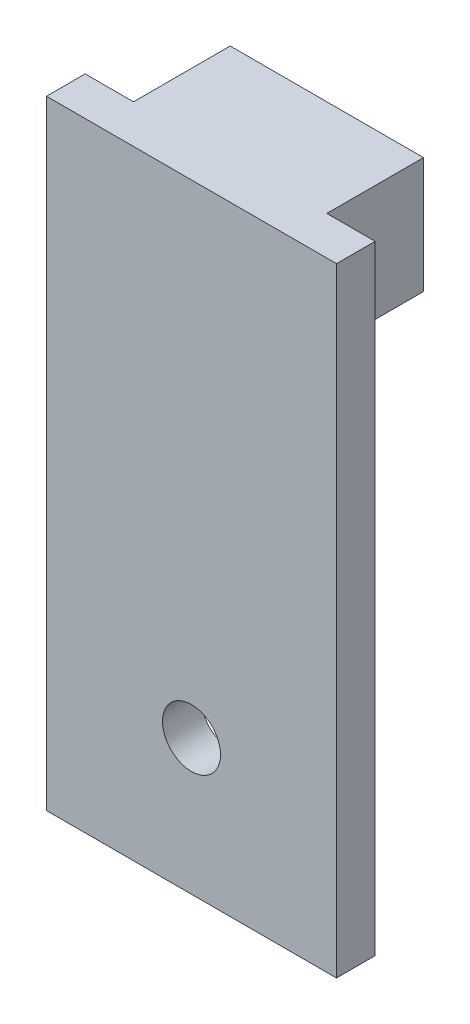
ISO-10303-21;
HEADER;
FILE_DESCRIPTION(('STEP AP214'),'2;1');
FILE_NAME('part.step','',(''),(''),'','','');
FILE_SCHEMA(('AUTOMOTIVE_DESIGN { 1 0 10303 214 1 1 1 1 }'));
ENDSEC;
DATA;
#1=APPLICATION_CONTEXT('core data for automotive mechanical design processes');
#2=APPLICATION_PROTOCOL_DEFINITION('international standard','automotive_design',2000,#1);
#3=PRODUCT_CONTEXT('',#1,'mechanical');
#4=PRODUCT('Part','Part','',(#3));
#5=PRODUCT_RELATED_PRODUCT_CATEGORY('part','',(#4));
#6=PRODUCT_DEFINITION_FORMATION('','',#4);
#7=PRODUCT_DEFINITION_CONTEXT('part definition',#1,'design');
#8=PRODUCT_DEFINITION('design','',#6,#7);
#9=PRODUCT_DEFINITION_SHAPE('','',#8);
#10=(LENGTH_UNIT() NAMED_UNIT(*) SI_UNIT(.MILLI.,.METRE.));
#11=(NAMED_UNIT(*) PLANE_ANGLE_UNIT() SI_UNIT($,.RADIAN.));
#12=(NAMED_UNIT(*) SI_UNIT($,.STERADIAN.) SOLID_ANGLE_UNIT());
#13=UNCERTAINTY_MEASURE_WITH_UNIT(LENGTH_MEASURE(1.E-05),#10,'distance_accuracy_value','');
#14=(GEOMETRIC_REPRESENTATION_CONTEXT(3) GLOBAL_UNCERTAINTY_ASSIGNED_CONTEXT((#13)) GLOBAL_UNIT_ASSIGNED_CONTEXT((#10,
#11,#12)) REPRESENTATION_CONTEXT('',''));
#15=CARTESIAN_POINT('',(0.,0.,0.));
#16=DIRECTION('',(0.,0.,1.));
#17=DIRECTION('',(1.,0.,0.));
#18=AXIS2_PLACEMENT_3D('',#15,#16,#17);
#19=CARTESIAN_POINT('',(0.,0.,0.));
#20=DIRECTION('',(0.,0.,1.));
#21=DIRECTION('',(1.,0.,0.));
#22=AXIS2_PLACEMENT_3D('',#19,#20,#21);
#23=PLANE('',#22);
#24=CARTESIAN_POINT('',(0.,-9.00000000000001,0.));
#25=DIRECTION('',(0.,0.,1.));
#26=DIRECTION('',(1.,0.,0.));
#27=AXIS2_PLACEMENT_3D('',#24,#25,#26);
#28=CIRCLE('',#27,1.5);
#29=CARTESIAN_POINT('',(1.5,-9.00000000000001,0.));
#30=VERTEX_POINT('',#29);
#31=EDGE_CURVE('E156',#30,#30,#28,.T.);
#32=ORIENTED_EDGE('',*,*,#31,.T.);
#33=EDGE_LOOP('',(#32));
#34=FACE_BOUND('',#33,.T.);
#35=DIRECTION('',(0.,1.,0.));
#36=VECTOR('',#35,1.);
#37=CARTESIAN_POINT('',(-5.,16.,0.));
#38=LINE('',#37,#36);
#39=CARTESIAN_POINT('',(-5.,10.,0.));
#40=VERTEX_POINT('',#39);
#41=CARTESIAN_POINT('',(-5.,16.,0.));
#42=VERTEX_POINT('',#41);
#43=EDGE_CURVE('E131',#40,#42,#38,.T.);
#44=ORIENTED_EDGE('',*,*,#43,.F.);
#45=DIRECTION('',(-1.,0.,0.));
#46=VECTOR('',#45,1.);
#47=CARTESIAN_POINT('',(5.,10.,0.));
#48=LINE('',#47,#46);
#49=CARTESIAN_POINT('',(5.,10.,0.));
#50=VERTEX_POINT('',#49);
#51=EDGE_CURVE('E117',#50,#40,#48,.T.);
#52=ORIENTED_EDGE('',*,*,#51,.F.);
#53=DIRECTION('',(0.,-1.,0.));
#54=VECTOR('',#53,1.);
#55=CARTESIAN_POINT('',(5.,16.,0.));
#56=LINE('',#55,#54);
#57=CARTESIAN_POINT('',(5.,16.,0.));
#58=VERTEX_POINT('',#57);
#59=EDGE_CURVE('E127',#58,#50,#56,.T.);
#60=ORIENTED_EDGE('',*,*,#59,.F.);
#61=DIRECTION('',(-1.,0.,0.));
#62=VECTOR('',#61,1.);
#63=CARTESIAN_POINT('',(-7.5,16.,0.));
#64=LINE('',#63,#62);
#65=CARTESIAN_POINT('',(7.5,16.,0.));
#66=VERTEX_POINT('',#65);
#67=EDGE_CURVE('E189',#66,#58,#64,.T.);
#68=ORIENTED_EDGE('',*,*,#67,.F.);
#69=DIRECTION('',(0.,1.,0.));
#70=VECTOR('',#69,1.);
#71=CARTESIAN_POINT('',(7.5,16.,0.));
#72=LINE('',#71,#70);
#73=CARTESIAN_POINT('',(7.5,-16.,0.));
#74=VERTEX_POINT('',#73);
#75=EDGE_CURVE('E182',#74,#66,#72,.T.);
#76=ORIENTED_EDGE('',*,*,#75,.F.);
#77=DIRECTION('',(1.,0.,0.));
#78=VECTOR('',#77,1.);
#79=CARTESIAN_POINT('',(-7.5,-16.,0.));
#80=LINE('',#79,#78);
#81=CARTESIAN_POINT('',(-7.5,-16.,0.));
#82=VERTEX_POINT('',#81);
#83=EDGE_CURVE('E209',#82,#74,#80,.T.);
#84=ORIENTED_EDGE('',*,*,#83,.F.);
#85=DIRECTION('',(0.,-1.,0.));
#86=VECTOR('',#85,1.);
#87=CARTESIAN_POINT('',(-7.5,16.,0.));
#88=LINE('',#87,#86);
#89=CARTESIAN_POINT('',(-7.5,16.,0.));
#90=VERTEX_POINT('',#89);
#91=EDGE_CURVE('E195',#90,#82,#88,.T.);
#92=ORIENTED_EDGE('',*,*,#91,.F.);
#93=EDGE_CURVE('E138',#42,#90,#64,.T.);
#94=ORIENTED_EDGE('',*,*,#93,.F.);
#95=EDGE_LOOP('',(#44,#52,#60,#68,#76,#84,#92,#94));
#96=FACE_BOUND('',#95,.T.);
#97=ADVANCED_FACE('F36',(#34,#96),#23,.F.);
#98=CARTESIAN_POINT('',(7.5,16.,2.));
#99=DIRECTION('',(-1.,0.,0.));
#100=DIRECTION('',(0.,-1.,0.));
#101=AXIS2_PLACEMENT_3D('',#98,#99,#100);
#102=PLANE('',#101);
#103=ORIENTED_EDGE('',*,*,#75,.T.);
#104=DIRECTION('',(0.,0.,-1.));
#105=VECTOR('',#104,1.);
#106=CARTESIAN_POINT('',(7.5,16.,2.));
#107=LINE('',#106,#105);
#108=CARTESIAN_POINT('',(7.5,16.,2.));
#109=VERTEX_POINT('',#108);
#110=EDGE_CURVE('E199',#109,#66,#107,.T.);
#111=ORIENTED_EDGE('',*,*,#110,.F.);
#112=DIRECTION('',(0.,1.,0.));
#113=VECTOR('',#112,1.);
#114=CARTESIAN_POINT('',(7.5,16.,2.));
#115=LINE('',#114,#113);
#116=CARTESIAN_POINT('',(7.5,-16.,2.));
#117=VERTEX_POINT('',#116);
#118=EDGE_CURVE('E210',#117,#109,#115,.T.);
#119=ORIENTED_EDGE('',*,*,#118,.F.);
#120=DIRECTION('',(0.,0.,-1.));
#121=VECTOR('',#120,1.);
#122=CARTESIAN_POINT('',(7.5,-16.,2.));
#123=LINE('',#122,#121);
#124=EDGE_CURVE('E208',#117,#74,#123,.T.);
#125=ORIENTED_EDGE('',*,*,#124,.T.);
#126=EDGE_LOOP('',(#103,#111,#119,#125));
#127=FACE_BOUND('',#126,.T.);
#128=ADVANCED_FACE('F227',(#127),#102,.F.);
#129=CARTESIAN_POINT('',(-7.5,16.,2.));
#130=DIRECTION('',(0.,-1.,0.));
#131=DIRECTION('',(0.,0.,-1.));
#132=AXIS2_PLACEMENT_3D('',#129,#130,#131);
#133=PLANE('',#132);
#134=DIRECTION('',(0.,0.,1.));
#135=VECTOR('',#134,1.);
#136=CARTESIAN_POINT('',(5.,16.,-6.));
#137=LINE('',#136,#135);
#138=CARTESIAN_POINT('',(5.,16.,-5.));
#139=VERTEX_POINT('',#138);
#140=EDGE_CURVE('E121',#139,#58,#137,.T.);
#141=ORIENTED_EDGE('',*,*,#140,.F.);
#142=DIRECTION('',(-1.,0.,0.));
#143=VECTOR('',#142,1.);
#144=CARTESIAN_POINT('',(-5.,16.,-5.));
#145=LINE('',#144,#143);
#146=CARTESIAN_POINT('',(-5.,16.,-5.));
#147=VERTEX_POINT('',#146);
#148=EDGE_CURVE('E45',#139,#147,#145,.T.);
#149=ORIENTED_EDGE('',*,*,#148,.T.);
#150=DIRECTION('',(0.,0.,1.));
#151=VECTOR('',#150,1.);
#152=CARTESIAN_POINT('',(-5.,16.,-6.));
#153=LINE('',#152,#151);
#154=EDGE_CURVE('E149',#147,#42,#153,.T.);
#155=ORIENTED_EDGE('',*,*,#154,.T.);
#156=ORIENTED_EDGE('',*,*,#93,.T.);
#157=DIRECTION('',(0.,0.,-1.));
#158=VECTOR('',#157,1.);
#159=CARTESIAN_POINT('',(-7.5,16.,2.));
#160=LINE('',#159,#158);
#161=CARTESIAN_POINT('',(-7.5,16.,2.));
#162=VERTEX_POINT('',#161);
#163=EDGE_CURVE('E202',#162,#90,#160,.T.);
#164=ORIENTED_EDGE('',*,*,#163,.F.);
#165=DIRECTION('',(-1.,0.,0.));
#166=VECTOR('',#165,1.);
#167=CARTESIAN_POINT('',(-7.5,16.,2.));
#168=LINE('',#167,#166);
#169=EDGE_CURVE('E215',#109,#162,#168,.T.);
#170=ORIENTED_EDGE('',*,*,#169,.F.);
#171=ORIENTED_EDGE('',*,*,#110,.T.);
#172=ORIENTED_EDGE('',*,*,#67,.T.);
#173=EDGE_LOOP('',(#141,#149,#155,#156,#164,#170,#171,#172));
#174=FACE_BOUND('',#173,.T.);
#175=ADVANCED_FACE('F225',(#174),#133,.F.);
#176=CARTESIAN_POINT('',(-7.5,16.,2.));
#177=DIRECTION('',(1.,0.,0.));
#178=DIRECTION('',(0.,1.,0.));
#179=AXIS2_PLACEMENT_3D('',#176,#177,#178);
#180=PLANE('',#179);
#181=ORIENTED_EDGE('',*,*,#91,.T.);
#182=DIRECTION('',(0.,0.,-1.));
#183=VECTOR('',#182,1.);
#184=CARTESIAN_POINT('',(-7.5,-16.,2.));
#185=LINE('',#184,#183);
#186=CARTESIAN_POINT('',(-7.5,-16.,2.));
#187=VERTEX_POINT('',#186);
#188=EDGE_CURVE('E205',#187,#82,#185,.T.);
#189=ORIENTED_EDGE('',*,*,#188,.F.);
#190=DIRECTION('',(0.,-1.,0.));
#191=VECTOR('',#190,1.);
#192=CARTESIAN_POINT('',(-7.5,16.,2.));
#193=LINE('',#192,#191);
#194=EDGE_CURVE('E230',#162,#187,#193,.T.);
#195=ORIENTED_EDGE('',*,*,#194,.F.);
#196=ORIENTED_EDGE('',*,*,#163,.T.);
#197=EDGE_LOOP('',(#181,#189,#195,#196));
#198=FACE_BOUND('',#197,.T.);
#199=ADVANCED_FACE('F220',(#198),#180,.F.);
#200=CARTESIAN_POINT('',(-7.5,-16.,2.));
#201=DIRECTION('',(0.,1.,0.));
#202=DIRECTION('',(0.,0.,1.));
#203=AXIS2_PLACEMENT_3D('',#200,#201,#202);
#204=PLANE('',#203);
#205=ORIENTED_EDGE('',*,*,#83,.T.);
#206=ORIENTED_EDGE('',*,*,#124,.F.);
#207=DIRECTION('',(1.,0.,0.));
#208=VECTOR('',#207,1.);
#209=CARTESIAN_POINT('',(-7.5,-16.,2.));
#210=LINE('',#209,#208);
#211=EDGE_CURVE('E191',#187,#117,#210,.T.);
#212=ORIENTED_EDGE('',*,*,#211,.F.);
#213=ORIENTED_EDGE('',*,*,#188,.T.);
#214=EDGE_LOOP('',(#205,#206,#212,#213));
#215=FACE_BOUND('',#214,.T.);
#216=ADVANCED_FACE('F224',(#215),#204,.F.);
#217=CARTESIAN_POINT('',(0.,0.,2.));
#218=DIRECTION('',(0.,0.,1.));
#219=DIRECTION('',(1.,0.,0.));
#220=AXIS2_PLACEMENT_3D('',#217,#218,#219);
#221=PLANE('',#220);
#222=CARTESIAN_POINT('',(0.,-9.00000000000001,2.));
#223=DIRECTION('',(0.,0.,1.));
#224=DIRECTION('',(1.,0.,0.));
#225=AXIS2_PLACEMENT_3D('',#222,#223,#224);
#226=CIRCLE('',#225,1.5);
#227=CARTESIAN_POINT('',(1.5,-9.00000000000001,2.));
#228=VERTEX_POINT('',#227);
#229=EDGE_CURVE('E373',#228,#228,#226,.T.);
#230=ORIENTED_EDGE('',*,*,#229,.F.);
#231=EDGE_LOOP('',(#230));
#232=FACE_BOUND('',#231,.T.);
#233=ORIENTED_EDGE('',*,*,#118,.T.);
#234=ORIENTED_EDGE('',*,*,#169,.T.);
#235=ORIENTED_EDGE('',*,*,#194,.T.);
#236=ORIENTED_EDGE('',*,*,#211,.T.);
#237=EDGE_LOOP('',(#233,#234,#235,#236));
#238=FACE_BOUND('',#237,.T.);
#239=ADVANCED_FACE('F229',(#232,#238),#221,.T.);
#240=CARTESIAN_POINT('',(-5.,16.,-6.));
#241=DIRECTION('',(1.,0.,0.));
#242=DIRECTION('',(0.,1.,0.));
#243=AXIS2_PLACEMENT_3D('',#240,#241,#242);
#244=PLANE('',#243);
#245=ORIENTED_EDGE('',*,*,#154,.F.);
#246=DIRECTION('',(0.,-1.,0.));
#247=VECTOR('',#246,1.);
#248=CARTESIAN_POINT('',(-5.,10.,-5.));
#249=LINE('',#248,#247);
#250=CARTESIAN_POINT('',(-5.,10.,-5.));
#251=VERTEX_POINT('',#250);
#252=EDGE_CURVE('E150',#147,#251,#249,.T.);
#253=ORIENTED_EDGE('',*,*,#252,.T.);
#254=DIRECTION('',(0.,0.,1.));
#255=VECTOR('',#254,1.);
#256=CARTESIAN_POINT('',(-5.,10.,-6.));
#257=LINE('',#256,#255);
#258=EDGE_CURVE('E122',#251,#40,#257,.T.);
#259=ORIENTED_EDGE('',*,*,#258,.T.);
#260=ORIENTED_EDGE('',*,*,#43,.T.);
#261=EDGE_LOOP('',(#245,#253,#259,#260));
#262=FACE_BOUND('',#261,.T.);
#263=ADVANCED_FACE('F289',(#262),#244,.F.);
#264=CARTESIAN_POINT('',(5.,16.,-6.));
#265=DIRECTION('',(-1.,0.,0.));
#266=DIRECTION('',(0.,-1.,0.));
#267=AXIS2_PLACEMENT_3D('',#264,#265,#266);
#268=PLANE('',#267);
#269=DIRECTION('',(0.,0.,1.));
#270=VECTOR('',#269,1.);
#271=CARTESIAN_POINT('',(5.,10.,-6.));
#272=LINE('',#271,#270);
#273=CARTESIAN_POINT('',(5.,10.,-5.));
#274=VERTEX_POINT('',#273);
#275=EDGE_CURVE('E113',#274,#50,#272,.T.);
#276=ORIENTED_EDGE('',*,*,#275,.F.);
#277=DIRECTION('',(0.,1.,0.));
#278=VECTOR('',#277,1.);
#279=CARTESIAN_POINT('',(5.,16.,-5.));
#280=LINE('',#279,#278);
#281=EDGE_CURVE('E11',#274,#139,#280,.T.);
#282=ORIENTED_EDGE('',*,*,#281,.T.);
#283=ORIENTED_EDGE('',*,*,#140,.T.);
#284=ORIENTED_EDGE('',*,*,#59,.T.);
#285=EDGE_LOOP('',(#276,#282,#283,#284));
#286=FACE_BOUND('',#285,.T.);
#287=ADVANCED_FACE('F133',(#286),#268,.F.);
#288=CARTESIAN_POINT('',(5.,10.,-6.));
#289=DIRECTION('',(0.,1.,0.));
#290=DIRECTION('',(0.,0.,1.));
#291=AXIS2_PLACEMENT_3D('',#288,#289,#290);
#292=PLANE('',#291);
#293=ORIENTED_EDGE('',*,*,#258,.F.);
#294=DIRECTION('',(1.,0.,0.));
#295=VECTOR('',#294,1.);
#296=CARTESIAN_POINT('',(5.,10.,-5.));
#297=LINE('',#296,#295);
#298=EDGE_CURVE('E119',#251,#274,#297,.T.);
#299=ORIENTED_EDGE('',*,*,#298,.T.);
#300=ORIENTED_EDGE('',*,*,#275,.T.);
#301=ORIENTED_EDGE('',*,*,#51,.T.);
#302=EDGE_LOOP('',(#293,#299,#300,#301));
#303=FACE_BOUND('',#302,.T.);
#304=ADVANCED_FACE('F116',(#303),#292,.F.);
#305=CARTESIAN_POINT('',(0.,0.,-6.));
#306=DIRECTION('',(0.,0.,-1.));
#307=DIRECTION('',(-1.,0.,0.));
#308=AXIS2_PLACEMENT_3D('',#305,#306,#307);
#309=PLANE('',#308);
#310=DIRECTION('',(0.,-1.,0.));
#311=VECTOR('',#310,1.);
#312=CARTESIAN_POINT('',(4.,10.,-6.));
#313=LINE('',#312,#311);
#314=CARTESIAN_POINT('',(4.,15.,-6.));
#315=VERTEX_POINT('',#314);
#316=CARTESIAN_POINT('',(4.,11.,-6.));
#317=VERTEX_POINT('',#316);
#318=EDGE_CURVE('E169',#315,#317,#313,.T.);
#319=ORIENTED_EDGE('',*,*,#318,.T.);
#320=DIRECTION('',(-1.,0.,0.));
#321=VECTOR('',#320,1.);
#322=CARTESIAN_POINT('',(-5.,11.,-6.));
#323=LINE('',#322,#321);
#324=CARTESIAN_POINT('',(-4.,11.,-6.));
#325=VERTEX_POINT('',#324);
#326=EDGE_CURVE('E176',#317,#325,#323,.T.);
#327=ORIENTED_EDGE('',*,*,#326,.T.);
#328=DIRECTION('',(0.,1.,0.));
#329=VECTOR('',#328,1.);
#330=CARTESIAN_POINT('',(-4.,16.,-6.));
#331=LINE('',#330,#329);
#332=CARTESIAN_POINT('',(-4.,15.,-6.));
#333=VERTEX_POINT('',#332);
#334=EDGE_CURVE('E179',#325,#333,#331,.T.);
#335=ORIENTED_EDGE('',*,*,#334,.T.);
#336=DIRECTION('',(1.,0.,0.));
#337=VECTOR('',#336,1.);
#338=CARTESIAN_POINT('',(5.,15.,-6.));
#339=LINE('',#338,#337);
#340=EDGE_CURVE('E172',#333,#315,#339,.T.);
#341=ORIENTED_EDGE('',*,*,#340,.T.);
#342=EDGE_LOOP('',(#319,#327,#335,#341));
#343=FACE_BOUND('',#342,.T.);
#344=ADVANCED_FACE('F240',(#343),#309,.T.);
#345=CARTESIAN_POINT('',(0.,15.,-6.));
#346=DIRECTION('',(0.,0.707106781186547,-0.707106781186547));
#347=DIRECTION('',(-1.,0.,0.));
#348=AXIS2_PLACEMENT_3D('',#345,#346,#347);
#349=PLANE('',#348);
#350=DIRECTION('',(-0.577350269189625,0.577350269189626,0.577350269189626));
#351=VECTOR('',#350,1.);
#352=CARTESIAN_POINT('',(-2.66666666666667,13.6666666666667,-7.33333333333333));
#353=LINE('',#352,#351);
#354=EDGE_CURVE('E157',#147,#333,#353,.F.);
#355=ORIENTED_EDGE('',*,*,#354,.F.);
#356=ORIENTED_EDGE('',*,*,#148,.F.);
#357=DIRECTION('',(0.577350269189626,0.577350269189626,0.577350269189626));
#358=VECTOR('',#357,1.);
#359=CARTESIAN_POINT('',(-1.,10.,-11.));
#360=LINE('',#359,#358);
#361=EDGE_CURVE('E40',#315,#139,#360,.T.);
#362=ORIENTED_EDGE('',*,*,#361,.F.);
#363=ORIENTED_EDGE('',*,*,#340,.F.);
#364=EDGE_LOOP('',(#355,#356,#362,#363));
#365=FACE_BOUND('',#364,.T.);
#366=ADVANCED_FACE('F38',(#365),#349,.T.);
#367=CARTESIAN_POINT('',(4.,0.,-6.));
#368=DIRECTION('',(0.707106781186547,0.,-0.707106781186548));
#369=DIRECTION('',(0.,1.,0.));
#370=AXIS2_PLACEMENT_3D('',#367,#368,#369);
#371=PLANE('',#370);
#372=ORIENTED_EDGE('',*,*,#361,.T.);
#373=ORIENTED_EDGE('',*,*,#281,.F.);
#374=DIRECTION('',(-0.577350269189626,0.577350269189626,-0.577350269189626));
#375=VECTOR('',#374,1.);
#376=CARTESIAN_POINT('',(7.66666666666666,7.33333333333333,-2.33333333333334));
#377=LINE('',#376,#375);
#378=EDGE_CURVE('E155',#317,#274,#377,.F.);
#379=ORIENTED_EDGE('',*,*,#378,.F.);
#380=ORIENTED_EDGE('',*,*,#318,.F.);
#381=EDGE_LOOP('',(#372,#373,#379,#380));
#382=FACE_BOUND('',#381,.T.);
#383=ADVANCED_FACE('F167',(#382),#371,.T.);
#384=CARTESIAN_POINT('',(-4.,0.,-6.));
#385=DIRECTION('',(-0.707106781186548,0.,-0.707106781186547));
#386=DIRECTION('',(0.,-1.,0.));
#387=AXIS2_PLACEMENT_3D('',#384,#385,#386);
#388=PLANE('',#387);
#389=ORIENTED_EDGE('',*,*,#354,.T.);
#390=ORIENTED_EDGE('',*,*,#334,.F.);
#391=DIRECTION('',(-0.577350269189625,-0.577350269189626,0.577350269189626));
#392=VECTOR('',#391,1.);
#393=CARTESIAN_POINT('',(-7.66666666666667,7.33333333333333,-2.33333333333333));
#394=LINE('',#393,#392);
#395=EDGE_CURVE('E153',#251,#325,#394,.F.);
#396=ORIENTED_EDGE('',*,*,#395,.F.);
#397=ORIENTED_EDGE('',*,*,#252,.F.);
#398=EDGE_LOOP('',(#389,#390,#396,#397));
#399=FACE_BOUND('',#398,.T.);
#400=ADVANCED_FACE('F174',(#399),#388,.T.);
#401=CARTESIAN_POINT('',(0.,11.,-6.));
#402=DIRECTION('',(0.,-0.707106781186547,-0.707106781186547));
#403=DIRECTION('',(1.,0.,0.));
#404=AXIS2_PLACEMENT_3D('',#401,#402,#403);
#405=PLANE('',#404);
#406=ORIENTED_EDGE('',*,*,#378,.T.);
#407=ORIENTED_EDGE('',*,*,#298,.F.);
#408=ORIENTED_EDGE('',*,*,#395,.T.);
#409=ORIENTED_EDGE('',*,*,#326,.F.);
#410=EDGE_LOOP('',(#406,#407,#408,#409));
#411=FACE_BOUND('',#410,.T.);
#412=ADVANCED_FACE('F243',(#411),#405,.T.);
#413=CARTESIAN_POINT('',(0.,-9.00000000000001,-26.));
#414=DIRECTION('',(0.,0.,1.));
#415=DIRECTION('',(1.,0.,0.));
#416=AXIS2_PLACEMENT_3D('',#413,#414,#415);
#417=CYLINDRICAL_SURFACE('',#416,1.5);
#418=ORIENTED_EDGE('',*,*,#229,.T.);
#419=EDGE_LOOP('',(#418));
#420=FACE_BOUND('',#419,.T.);
#421=ORIENTED_EDGE('',*,*,#31,.F.);
#422=EDGE_LOOP('',(#421));
#423=FACE_BOUND('',#422,.T.);
#424=ADVANCED_FACE('F245',(#420,#423),#417,.F.);
#425=CLOSED_SHELL('',(#97,#128,#175,#199,#216,#239,#263,#287,#304,#344,#366,#383,#400,#412,#424));
#426=MANIFOLD_SOLID_BREP('B2',#425);
#427=ADVANCED_BREP_SHAPE_REPRESENTATION('',(#18,#426),#14);
#428=SHAPE_DEFINITION_REPRESENTATION(#9,#427);
ENDSEC;
END-ISO-10303-21;
